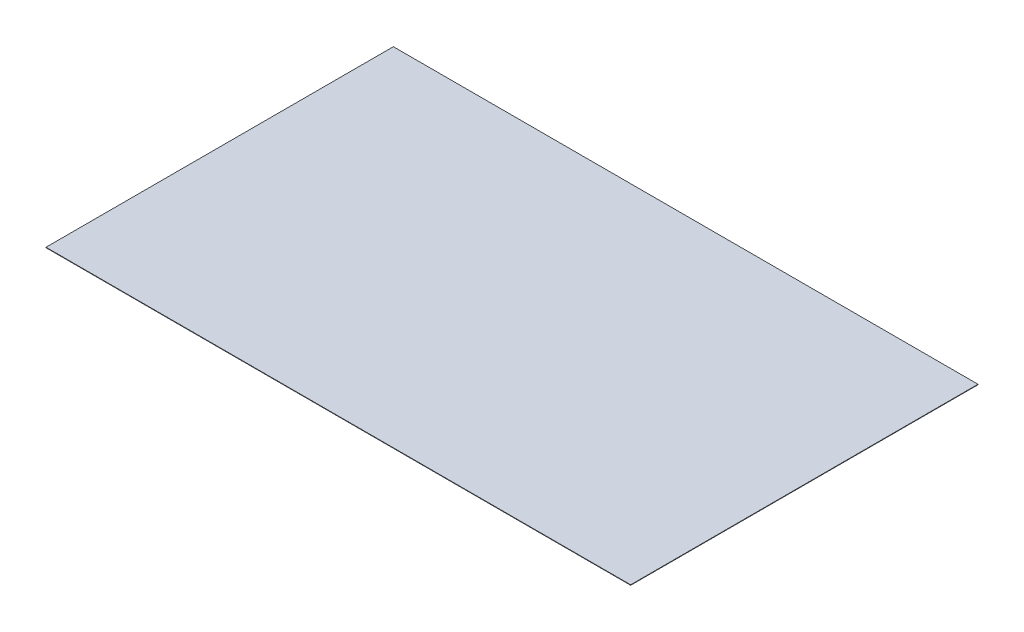
ISO-10303-21;
HEADER;
FILE_DESCRIPTION(('STEP AP214'),'2;1');
FILE_NAME('part.step','',(''),(''),'','','');
FILE_SCHEMA(('AUTOMOTIVE_DESIGN { 1 0 10303 214 1 1 1 1 }'));
ENDSEC;
DATA;
#1=APPLICATION_CONTEXT('core data for automotive mechanical design processes');
#2=APPLICATION_PROTOCOL_DEFINITION('international standard','automotive_design',2000,#1);
#3=PRODUCT_CONTEXT('',#1,'mechanical');
#4=PRODUCT('Part','Part','',(#3));
#5=PRODUCT_RELATED_PRODUCT_CATEGORY('part','',(#4));
#6=PRODUCT_DEFINITION_FORMATION('','',#4);
#7=PRODUCT_DEFINITION_CONTEXT('part definition',#1,'design');
#8=PRODUCT_DEFINITION('design','',#6,#7);
#9=PRODUCT_DEFINITION_SHAPE('','',#8);
#10=(LENGTH_UNIT() NAMED_UNIT(*) SI_UNIT(.MILLI.,.METRE.));
#11=(NAMED_UNIT(*) PLANE_ANGLE_UNIT() SI_UNIT($,.RADIAN.));
#12=(NAMED_UNIT(*) SI_UNIT($,.STERADIAN.) SOLID_ANGLE_UNIT());
#13=UNCERTAINTY_MEASURE_WITH_UNIT(LENGTH_MEASURE(1.E-05),#10,'distance_accuracy_value','');
#14=(GEOMETRIC_REPRESENTATION_CONTEXT(3) GLOBAL_UNCERTAINTY_ASSIGNED_CONTEXT((#13)) GLOBAL_UNIT_ASSIGNED_CONTEXT((#10,
#11,#12)) REPRESENTATION_CONTEXT('',''));
#15=CARTESIAN_POINT('',(0.,0.,0.));
#16=DIRECTION('',(0.,0.,1.));
#17=DIRECTION('',(1.,0.,0.));
#18=AXIS2_PLACEMENT_3D('',#15,#16,#17);
#19=CARTESIAN_POINT('',(62.5,181.5,-757.5));
#20=DIRECTION('',(-1.,0.,0.));
#21=DIRECTION('',(0.,0.,1.));
#22=AXIS2_PLACEMENT_3D('',#19,#20,#21);
#23=PLANE('',#22);
#24=DIRECTION('',(0.,-1.,0.));
#25=VECTOR('',#24,1.);
#26=CARTESIAN_POINT('',(62.5,181.5,0.));
#27=LINE('',#26,#25);
#28=CARTESIAN_POINT('',(62.5,182.5,0.));
#29=VERTEX_POINT('',#28);
#30=CARTESIAN_POINT('',(62.5,181.5,0.));
#31=VERTEX_POINT('',#30);
#32=EDGE_CURVE('E103',#29,#31,#27,.T.);
#33=ORIENTED_EDGE('',*,*,#32,.F.);
#34=DIRECTION('',(0.,0.,1.));
#35=VECTOR('',#34,1.);
#36=CARTESIAN_POINT('',(62.5,182.5,-757.5));
#37=LINE('',#36,#35);
#38=CARTESIAN_POINT('',(62.5,182.5,-757.5));
#39=VERTEX_POINT('',#38);
#40=EDGE_CURVE('E11',#39,#29,#37,.T.);
#41=ORIENTED_EDGE('',*,*,#40,.F.);
#42=DIRECTION('',(0.,-1.,0.));
#43=VECTOR('',#42,1.);
#44=CARTESIAN_POINT('',(62.5,181.5,-757.5));
#45=LINE('',#44,#43);
#46=CARTESIAN_POINT('',(62.5,181.5,-757.5));
#47=VERTEX_POINT('',#46);
#48=EDGE_CURVE('E97',#39,#47,#45,.T.);
#49=ORIENTED_EDGE('',*,*,#48,.T.);
#50=DIRECTION('',(0.,0.,1.));
#51=VECTOR('',#50,1.);
#52=CARTESIAN_POINT('',(62.5,181.5,-757.5));
#53=LINE('',#52,#51);
#54=EDGE_CURVE('E42',#47,#31,#53,.T.);
#55=ORIENTED_EDGE('',*,*,#54,.T.);
#56=EDGE_LOOP('',(#33,#41,#49,#55));
#57=FACE_BOUND('',#56,.T.);
#58=ADVANCED_FACE('F39',(#57),#23,.T.);
#59=CARTESIAN_POINT('',(62.5,182.5,-757.5));
#60=DIRECTION('',(0.,1.,0.));
#61=DIRECTION('',(0.,0.,1.));
#62=AXIS2_PLACEMENT_3D('',#59,#60,#61);
#63=PLANE('',#62);
#64=DIRECTION('',(-1.,0.,0.));
#65=VECTOR('',#64,1.);
#66=CARTESIAN_POINT('',(62.5,182.5,0.));
#67=LINE('',#66,#65);
#68=CARTESIAN_POINT('',(1337.5,182.5,0.));
#69=VERTEX_POINT('',#68);
#70=EDGE_CURVE('E99',#69,#29,#67,.T.);
#71=ORIENTED_EDGE('',*,*,#70,.F.);
#72=DIRECTION('',(0.,0.,1.));
#73=VECTOR('',#72,1.);
#74=CARTESIAN_POINT('',(1337.5,182.5,-757.5));
#75=LINE('',#74,#73);
#76=CARTESIAN_POINT('',(1337.5,182.5,-757.5));
#77=VERTEX_POINT('',#76);
#78=EDGE_CURVE('E48',#77,#69,#75,.T.);
#79=ORIENTED_EDGE('',*,*,#78,.F.);
#80=DIRECTION('',(-1.,0.,0.));
#81=VECTOR('',#80,1.);
#82=CARTESIAN_POINT('',(62.5,182.5,-757.5));
#83=LINE('',#82,#81);
#84=EDGE_CURVE('E94',#77,#39,#83,.T.);
#85=ORIENTED_EDGE('',*,*,#84,.T.);
#86=ORIENTED_EDGE('',*,*,#40,.T.);
#87=EDGE_LOOP('',(#71,#79,#85,#86));
#88=FACE_BOUND('',#87,.T.);
#89=ADVANCED_FACE('F113',(#88),#63,.T.);
#90=CARTESIAN_POINT('',(1337.5,181.5,-757.5));
#91=DIRECTION('',(1.,0.,0.));
#92=DIRECTION('',(0.,0.,-1.));
#93=AXIS2_PLACEMENT_3D('',#90,#91,#92);
#94=PLANE('',#93);
#95=DIRECTION('',(0.,1.,0.));
#96=VECTOR('',#95,1.);
#97=CARTESIAN_POINT('',(1337.5,181.5,0.));
#98=LINE('',#97,#96);
#99=CARTESIAN_POINT('',(1337.5,181.5,0.));
#100=VERTEX_POINT('',#99);
#101=EDGE_CURVE('E89',#100,#69,#98,.T.);
#102=ORIENTED_EDGE('',*,*,#101,.F.);
#103=DIRECTION('',(0.,0.,1.));
#104=VECTOR('',#103,1.);
#105=CARTESIAN_POINT('',(1337.5,181.5,-757.5));
#106=LINE('',#105,#104);
#107=CARTESIAN_POINT('',(1337.5,181.5,-757.5));
#108=VERTEX_POINT('',#107);
#109=EDGE_CURVE('E84',#108,#100,#106,.T.);
#110=ORIENTED_EDGE('',*,*,#109,.F.);
#111=DIRECTION('',(0.,1.,0.));
#112=VECTOR('',#111,1.);
#113=CARTESIAN_POINT('',(1337.5,181.5,-757.5));
#114=LINE('',#113,#112);
#115=EDGE_CURVE('E87',#108,#77,#114,.T.);
#116=ORIENTED_EDGE('',*,*,#115,.T.);
#117=ORIENTED_EDGE('',*,*,#78,.T.);
#118=EDGE_LOOP('',(#102,#110,#116,#117));
#119=FACE_BOUND('',#118,.T.);
#120=ADVANCED_FACE('F86',(#119),#94,.T.);
#121=CARTESIAN_POINT('',(62.5,181.5,-757.5));
#122=DIRECTION('',(0.,-1.,0.));
#123=DIRECTION('',(0.,0.,-1.));
#124=AXIS2_PLACEMENT_3D('',#121,#122,#123);
#125=PLANE('',#124);
#126=DIRECTION('',(1.,0.,0.));
#127=VECTOR('',#126,1.);
#128=CARTESIAN_POINT('',(62.5,181.5,0.));
#129=LINE('',#128,#127);
#130=EDGE_CURVE('E106',#31,#100,#129,.T.);
#131=ORIENTED_EDGE('',*,*,#130,.F.);
#132=ORIENTED_EDGE('',*,*,#54,.F.);
#133=DIRECTION('',(1.,0.,0.));
#134=VECTOR('',#133,1.);
#135=CARTESIAN_POINT('',(62.5,181.5,-757.5));
#136=LINE('',#135,#134);
#137=EDGE_CURVE('E93',#47,#108,#136,.T.);
#138=ORIENTED_EDGE('',*,*,#137,.T.);
#139=ORIENTED_EDGE('',*,*,#109,.T.);
#140=EDGE_LOOP('',(#131,#132,#138,#139));
#141=FACE_BOUND('',#140,.T.);
#142=ADVANCED_FACE('F96',(#141),#125,.T.);
#143=CARTESIAN_POINT('',(0.,0.,-757.5));
#144=DIRECTION('',(0.,0.,-1.));
#145=DIRECTION('',(-1.,0.,0.));
#146=AXIS2_PLACEMENT_3D('',#143,#144,#145);
#147=PLANE('',#146);
#148=ORIENTED_EDGE('',*,*,#48,.F.);
#149=ORIENTED_EDGE('',*,*,#84,.F.);
#150=ORIENTED_EDGE('',*,*,#115,.F.);
#151=ORIENTED_EDGE('',*,*,#137,.F.);
#152=EDGE_LOOP('',(#148,#149,#150,#151));
#153=FACE_BOUND('',#152,.T.);
#154=ADVANCED_FACE('F92',(#153),#147,.T.);
#155=CARTESIAN_POINT('',(0.,0.,0.));
#156=DIRECTION('',(0.,0.,-1.));
#157=DIRECTION('',(-1.,0.,0.));
#158=AXIS2_PLACEMENT_3D('',#155,#156,#157);
#159=PLANE('',#158);
#160=ORIENTED_EDGE('',*,*,#32,.T.);
#161=ORIENTED_EDGE('',*,*,#130,.T.);
#162=ORIENTED_EDGE('',*,*,#101,.T.);
#163=ORIENTED_EDGE('',*,*,#70,.T.);
#164=EDGE_LOOP('',(#160,#161,#162,#163));
#165=FACE_BOUND('',#164,.T.);
#166=ADVANCED_FACE('F112',(#165),#159,.F.);
#167=CLOSED_SHELL('',(#58,#89,#120,#142,#154,#166));
#168=MANIFOLD_SOLID_BREP('B2',#167);
#169=ADVANCED_BREP_SHAPE_REPRESENTATION('',(#18,#168),#14);
#170=SHAPE_DEFINITION_REPRESENTATION(#9,#169);
ENDSEC;
END-ISO-10303-21;
